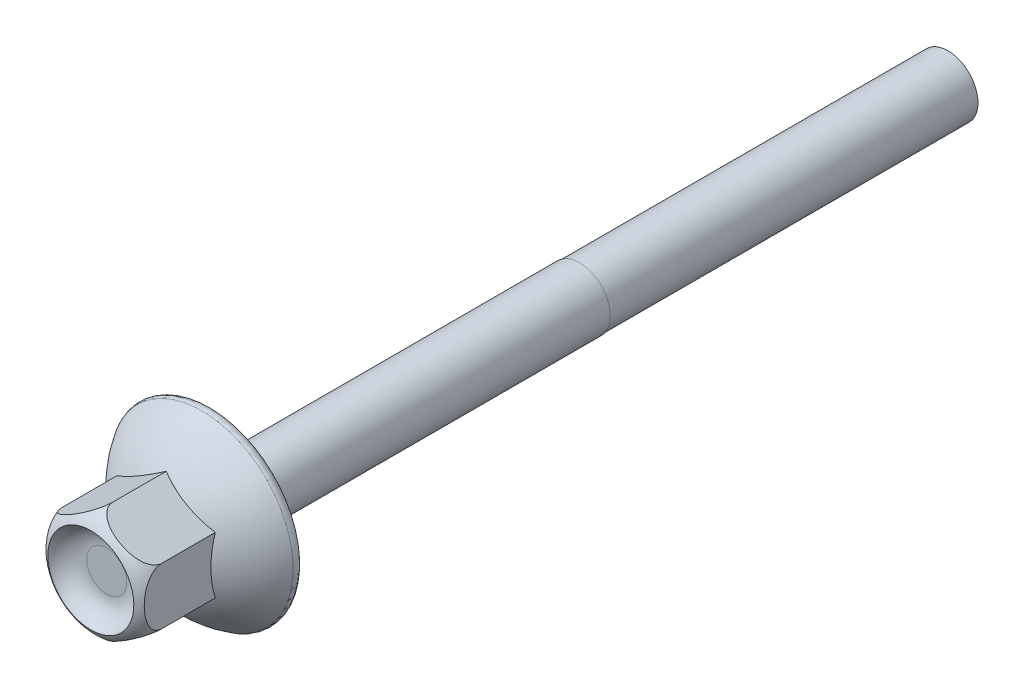
ISO-10303-21;
HEADER;
FILE_DESCRIPTION(('STEP AP214'),'2;1');
FILE_NAME('part.step','',(''),(''),'','','');
FILE_SCHEMA(('AUTOMOTIVE_DESIGN { 1 0 10303 214 1 1 1 1 }'));
ENDSEC;
DATA;
#1=APPLICATION_CONTEXT('core data for automotive mechanical design processes');
#2=APPLICATION_PROTOCOL_DEFINITION('international standard','automotive_design',2000,#1);
#3=PRODUCT_CONTEXT('',#1,'mechanical');
#4=PRODUCT('Part','Part','',(#3));
#5=PRODUCT_RELATED_PRODUCT_CATEGORY('part','',(#4));
#6=PRODUCT_DEFINITION_FORMATION('','',#4);
#7=PRODUCT_DEFINITION_CONTEXT('part definition',#1,'design');
#8=PRODUCT_DEFINITION('design','',#6,#7);
#9=PRODUCT_DEFINITION_SHAPE('','',#8);
#10=(LENGTH_UNIT() NAMED_UNIT(*) SI_UNIT(.MILLI.,.METRE.));
#11=(NAMED_UNIT(*) PLANE_ANGLE_UNIT() SI_UNIT($,.RADIAN.));
#12=(NAMED_UNIT(*) SI_UNIT($,.STERADIAN.) SOLID_ANGLE_UNIT());
#13=UNCERTAINTY_MEASURE_WITH_UNIT(LENGTH_MEASURE(1.E-05),#10,'distance_accuracy_value','');
#14=(GEOMETRIC_REPRESENTATION_CONTEXT(3) GLOBAL_UNCERTAINTY_ASSIGNED_CONTEXT((#13)) GLOBAL_UNIT_ASSIGNED_CONTEXT((#10,
#11,#12)) REPRESENTATION_CONTEXT('',''));
#15=CARTESIAN_POINT('',(0.,0.,0.));
#16=DIRECTION('',(0.,0.,1.));
#17=DIRECTION('',(1.,0.,0.));
#18=AXIS2_PLACEMENT_3D('',#15,#16,#17);
#19=CARTESIAN_POINT('',(0.,0.,-60.));
#20=DIRECTION('',(0.,0.,1.));
#21=DIRECTION('',(1.,0.,0.));
#22=AXIS2_PLACEMENT_3D('',#19,#20,#21);
#23=CYLINDRICAL_SURFACE('',#22,2.5);
#24=CARTESIAN_POINT('',(0.,0.,-0.5));
#25=DIRECTION('',(0.,0.,-1.));
#26=DIRECTION('',(-1.,0.,0.));
#27=AXIS2_PLACEMENT_3D('',#24,#25,#26);
#28=CIRCLE('',#27,2.5);
#29=CARTESIAN_POINT('',(-2.5,0.,-0.5));
#30=VERTEX_POINT('',#29);
#31=EDGE_CURVE('E43',#30,#30,#28,.T.);
#32=ORIENTED_EDGE('',*,*,#31,.T.);
#33=EDGE_LOOP('',(#32));
#34=FACE_BOUND('',#33,.T.);
#35=CARTESIAN_POINT('',(0.,0.,-30.));
#36=DIRECTION('',(0.,0.,1.));
#37=DIRECTION('',(1.,0.,0.));
#38=AXIS2_PLACEMENT_3D('',#35,#36,#37);
#39=CIRCLE('',#38,2.5);
#40=CARTESIAN_POINT('',(2.5,0.,-30.));
#41=VERTEX_POINT('',#40);
#42=EDGE_CURVE('E242',#41,#41,#39,.T.);
#43=ORIENTED_EDGE('',*,*,#42,.T.);
#44=EDGE_LOOP('',(#43));
#45=FACE_BOUND('',#44,.T.);
#46=ADVANCED_FACE('F35',(#34,#45),#23,.T.);
#47=CARTESIAN_POINT('',(0.,4.618802153517,10.));
#48=DIRECTION('',(0.500000000000002,0.866025403784438,0.));
#49=DIRECTION('',(-0.866025403784438,0.500000000000002,0.));
#50=AXIS2_PLACEMENT_3D('',#47,#48,#49);
#51=PLANE('',#50);
#52=DIRECTION('',(0.,0.,-1.));
#53=VECTOR('',#52,1.);
#54=CARTESIAN_POINT('',(0.,4.618802153517,10.));
#55=LINE('',#54,#53);
#56=CARTESIAN_POINT('',(0.,4.618802153517,8.));
#57=VERTEX_POINT('',#56);
#58=CARTESIAN_POINT('',(0.,4.618802153517,3.65904363431918));
#59=VERTEX_POINT('',#58);
#60=EDGE_CURVE('E57',#57,#59,#55,.T.);
#61=ORIENTED_EDGE('',*,*,#60,.F.);
#62=CARTESIAN_POINT('',(1.73205083404458E-08,4.618802143517,7.9998));
#63=CARTESIAN_POINT('',(-1.22893199091104E-05,4.61880924875916,8.03431816225581));
#64=CARTESIAN_POINT('',(0.00153740433550257,4.61791453271004,8.06881155614293));
#65=CARTESIAN_POINT('',(0.00768344122339801,4.61436611665837,8.13740227827127));
#66=CARTESIAN_POINT('',(0.0122768861959812,4.61171408996694,8.17149995192029));
#67=CARTESIAN_POINT('',(0.0303716647498532,4.60126706469794,8.27200231166166));
#68=CARTESIAN_POINT('',(0.0481914301600321,4.59097881834147,8.33742428596317));
#69=CARTESIAN_POINT('',(0.093856980602336,4.56461380050092,8.46303313534248));
#70=CARTESIAN_POINT('',(0.121669862935469,4.54855602539894,8.52323639507381));
#71=CARTESIAN_POINT('',(0.185534124885321,4.5116839765706,8.63763523809825));
#72=CARTESIAN_POINT('',(0.221607223554268,4.49085716334358,8.69181441386976));
#73=CARTESIAN_POINT('',(0.313278704321013,4.43793060924589,8.81056740803764));
#74=CARTESIAN_POINT('',(0.371372616509075,4.40439007340583,8.87255920534204));
#75=CARTESIAN_POINT('',(0.49530398483919,4.3328382645394,8.98503906118911));
#76=CARTESIAN_POINT('',(0.561152304063222,4.29482071970972,9.03551068347922));
#77=CARTESIAN_POINT('',(0.733755651620931,4.19516813053424,9.14968315939336));
#78=CARTESIAN_POINT('',(0.843898079630224,4.13157737007388,9.20650397866911));
#79=CARTESIAN_POINT('',(1.07039157410927,4.0008112900667,9.30028658003631));
#80=CARTESIAN_POINT('',(1.18676057515877,3.93362561598545,9.33718718015741));
#81=CARTESIAN_POINT('',(1.39790502062674,3.81172131355662,9.38850358731781));
#82=CARTESIAN_POINT('',(1.49214319825864,3.7573128763329,9.4059982010007));
#83=CARTESIAN_POINT('',(1.68161527504161,3.64792112179834,9.43174086051479));
#84=CARTESIAN_POINT('',(1.77684983094431,3.59293742531176,9.43998236155293));
#85=CARTESIAN_POINT('',(1.96762379577052,3.48279402536497,9.44776580637858));
#86=CARTESIAN_POINT('',(2.06316332721299,3.42763425116841,9.44730364841325));
#87=CARTESIAN_POINT('',(2.25385330445278,3.31753934147725,9.43763209638059));
#88=CARTESIAN_POINT('',(2.34900394314503,3.26260409461472,9.42842775591044));
#89=CARTESIAN_POINT('',(2.57149003936678,3.13415168707014,9.39582481243822));
#90=CARTESIAN_POINT('',(2.6984282107637,3.06086389964369,9.36858439465794));
#91=CARTESIAN_POINT('',(2.94767138798115,2.91696328418352,9.2939671828279));
#92=CARTESIAN_POINT('',(3.0699890748671,2.84634313473326,9.24665064490689));
#93=CARTESIAN_POINT('',(3.26512073125793,2.7336838203886,9.14753213422416));
#94=CARTESIAN_POINT('',(3.34059182625356,2.69011056337683,9.10276216334356));
#95=CARTESIAN_POINT('',(3.48508090858181,2.60668975279966,9.00084422971363));
#96=CARTESIAN_POINT('',(3.55410599437833,2.5668381009342,8.94371011827995));
#97=CARTESIAN_POINT('',(3.66659330634959,2.50189352108717,8.83149504832667));
#98=CARTESIAN_POINT('',(3.71219218806112,2.47556699445628,8.77928649137942));
#99=CARTESIAN_POINT('',(3.79559765567049,2.42741282528012,8.66709210430393));
#100=CARTESIAN_POINT('',(3.83341346507607,2.40557985754019,8.60711561874414));
#101=CARTESIAN_POINT('',(3.89317358441181,2.37107733655489,8.49125810526627));
#102=CARTESIAN_POINT('',(3.91673672931674,2.35747314850108,8.43649352353463));
#103=CARTESIAN_POINT('',(3.95561680150908,2.33502572835472,8.3232176935301));
#104=CARTESIAN_POINT('',(3.97094866071704,2.32617387531383,8.26471344648954));
#105=CARTESIAN_POINT('',(3.98773636101545,2.31648149202746,8.17140101328874));
#106=CARTESIAN_POINT('',(3.99232622342284,2.31383153373101,8.13731321282773));
#107=CARTESIAN_POINT('',(3.9984657336852,2.31028688582834,8.06875760714334));
#108=CARTESIAN_POINT('',(4.00001380349469,2.30939310730711,8.03428961399965));
#109=CARTESIAN_POINT('',(3.99999998267949,2.30940108675849,7.9998));
#110=B_SPLINE_CURVE_WITH_KNOTS('',3,(#62,#63,#64,#65,#66,#67,#68,#69,#70,#71,#72,#73,#74,#75,
#76,#77,#78,#79,#80,#81,#82,#83,#84,#85,#86,#87,#88,#89,#90,#91,#92,#93,#94,#95,#96,#97,#98,#99,
#100,#101,#102,#103,#104,#105,#106,#107,#108,#109),.UNSPECIFIED.,.F.,.F.,(4,2,2,2,2,2,2,2,2,2,2,
2,2,2,2,2,2,2,2,2,2,2,2,4),(0.,0.103460373374438,0.206822373079677,0.411167373809311,
0.614845635749005,0.819065718174849,1.09157298206689,1.36446664498791,1.7800386431327,
2.1968798497368,2.52710929235976,2.8575721617821,3.18819077155664,3.51861837673778,
3.96475340106484,4.40955877111132,4.70268001276403,4.9954745605869,5.21714730311258,
5.43855581516425,5.6212654228744,5.80364245756453,5.90696999189714,6.01035111717634),.UNSPECIFIED.);
#111=CARTESIAN_POINT('',(4.00000000000001,2.30940107675848,8.));
#112=VERTEX_POINT('',#111);
#113=EDGE_CURVE('E50',#57,#112,#110,.T.);
#114=ORIENTED_EDGE('',*,*,#113,.T.);
#115=DIRECTION('',(0.,0.,-1.));
#116=VECTOR('',#115,1.);
#117=CARTESIAN_POINT('',(4.00000000000001,2.30940107675848,10.));
#118=LINE('',#117,#116);
#119=CARTESIAN_POINT('',(4.00000000000001,2.30940107675848,3.65904363431918));
#120=VERTEX_POINT('',#119);
#121=EDGE_CURVE('E98',#112,#120,#118,.T.);
#122=ORIENTED_EDGE('',*,*,#121,.T.);
#123=CARTESIAN_POINT('',(2.,3.46410161513774,-3.62499999999999));
#124=DIRECTION('',(0.500000000000002,0.866025403784438,0.));
#125=DIRECTION('',(-0.866025403784438,0.500000000000002,0.));
#126=AXIS2_PLACEMENT_3D('',#123,#124,#125);
#127=CIRCLE('',#126,7.6413758577889);
#128=EDGE_CURVE('E114',#120,#59,#127,.F.);
#129=ORIENTED_EDGE('',*,*,#128,.T.);
#130=EDGE_LOOP('',(#61,#114,#122,#129));
#131=FACE_BOUND('',#130,.T.);
#132=ADVANCED_FACE('F96',(#131),#51,.T.);
#133=CARTESIAN_POINT('',(4.00000000000001,2.30940107675848,10.));
#134=DIRECTION('',(1.,0.,0.));
#135=DIRECTION('',(0.,1.,0.));
#136=AXIS2_PLACEMENT_3D('',#133,#134,#135);
#137=PLANE('',#136);
#138=ORIENTED_EDGE('',*,*,#121,.F.);
#139=CARTESIAN_POINT('',(4.0000008798372,0.,9.44647626933986));
#140=CARTESIAN_POINT('',(4.00000085360112,-0.105466150957724,9.44647501003865));
#141=CARTESIAN_POINT('',(4.00000022876832,-0.210927246680293,9.44251378588974));
#142=CARTESIAN_POINT('',(3.99999977108024,-0.42131102905597,9.42641245729071));
#143=CARTESIAN_POINT('',(3.99999993874952,-0.526233313069076,9.414266940212));
#144=CARTESIAN_POINT('',(4.00000006109713,-0.734423127406882,9.3810900843605));
#145=CARTESIAN_POINT('',(4.00000001630765,-0.837694142877952,9.36008106793654));
#146=CARTESIAN_POINT('',(3.99999998371291,-1.04159399744332,9.30799308096921));
#147=CARTESIAN_POINT('',(3.99999999583586,-1.14222600388928,9.27692684111259));
#148=CARTESIAN_POINT('',(4.00000000377332,-1.32993087173156,9.20655533408771));
#149=CARTESIAN_POINT('',(4.00000000101161,-1.41738990231294,9.16829694595899));
#150=CARTESIAN_POINT('',(3.99999999898802,-1.58675370869468,9.0807236694283));
#151=CARTESIAN_POINT('',(3.9999999997274,-1.66865647242821,9.03140480328761));
#152=CARTESIAN_POINT('',(4.00000000027644,-1.82487594062848,8.91960170963039));
#153=CARTESIAN_POINT('',(4.00000000007283,-1.89906939872269,8.85694165578261));
#154=CARTESIAN_POINT('',(3.99999999992741,-2.03368206130457,8.71823168944842));
#155=CARTESIAN_POINT('',(3.99999999998469,-2.09414776283572,8.64222857080319));
#156=CARTESIAN_POINT('',(4.00000000000966,-2.17679914371866,8.50839655438855));
#157=CARTESIAN_POINT('',(4.00000000000258,-2.20488020236459,8.45419130281619));
#158=CARTESIAN_POINT('',(3.99999999999741,-2.25173689028514,8.34187413839059));
#159=CARTESIAN_POINT('',(3.9999999999993,-2.27051896731099,8.283764964289));
#160=CARTESIAN_POINT('',(4.00000000000069,-2.29760634851835,8.16482656570708));
#161=CARTESIAN_POINT('',(4.00000000000018,-2.30586019211316,8.10398547411485));
#162=CARTESIAN_POINT('',(3.99999999999981,-2.31110095157678,7.98181716174626));
#163=CARTESIAN_POINT('',(3.99999999999995,-2.30808963630325,7.92049001879874));
#164=CARTESIAN_POINT('',(4.00000000000004,-2.29167428794451,7.80389416202003));
#165=CARTESIAN_POINT('',(4.00000000000001,-2.27905330892728,7.74851225977821));
#166=CARTESIAN_POINT('',(3.99999999999998,-2.24513940042888,7.64049457018806));
#167=CARTESIAN_POINT('',(3.99999999999999,-2.22384549345326,7.58785909313403));
#168=CARTESIAN_POINT('',(4.,-2.17240359196328,7.48369756089591));
#169=CARTESIAN_POINT('',(4.,-2.14185153188739,7.43237274586351));
#170=CARTESIAN_POINT('',(3.99999999999999,-2.07385755974207,7.33454257718955));
#171=CARTESIAN_POINT('',(4.,-2.03641172978866,7.28803998773962));
#172=CARTESIAN_POINT('',(4.,-1.93387526489485,7.17589475761132));
#173=CARTESIAN_POINT('',(4.,-1.86490653793588,7.11379020091006));
#174=CARTESIAN_POINT('',(4.,-1.71798618081103,7.00135109459505));
#175=CARTESIAN_POINT('',(4.,-1.64001428213157,6.95104390652562));
#176=CARTESIAN_POINT('',(4.,-1.43551056630488,6.8373640207581));
#177=CARTESIAN_POINT('',(4.,-1.30505803550507,6.78109574593696));
#178=CARTESIAN_POINT('',(4.,-1.03711805910515,6.68886488522981));
#179=CARTESIAN_POINT('',(4.,-0.899610350073927,6.65296482290159));
#180=CARTESIAN_POINT('',(4.,-0.651254837129302,6.60394878199864));
#181=CARTESIAN_POINT('',(4.,-0.541017124907805,6.58759695984231));
#182=CARTESIAN_POINT('',(4.,-0.319491890305449,6.56422994713976));
#183=CARTESIAN_POINT('',(4.,-0.208203680944488,6.55722136436808));
#184=CARTESIAN_POINT('',(4.,0.0145780221954298,6.55206577272236));
#185=CARTESIAN_POINT('',(4.,0.126071526164903,6.55391921628541));
#186=CARTESIAN_POINT('',(4.,0.348477846232864,6.56662247812742));
#187=CARTESIAN_POINT('',(4.,0.459390984703597,6.57746661178463));
#188=CARTESIAN_POINT('',(4.,0.711465235515293,6.61336333324992));
#189=CARTESIAN_POINT('',(4.,0.852196697243031,6.64159453641364));
#190=CARTESIAN_POINT('',(4.,1.1283581749922,6.71709699547166));
#191=CARTESIAN_POINT('',(4.,1.26380137044526,6.76431709575379));
#192=CARTESIAN_POINT('',(4.,1.48275441367143,6.86334779079508));
#193=CARTESIAN_POINT('',(4.,1.56906661689595,6.90890745849698));
#194=CARTESIAN_POINT('',(4.00000000000001,1.73401701055087,7.01242012306373));
#195=CARTESIAN_POINT('',(4.00000000000001,1.81266446733514,7.07035787775811));
#196=CARTESIAN_POINT('',(4.00000000000001,1.93995118955534,7.18349351406201));
#197=CARTESIAN_POINT('',(4.,1.99117957775681,7.23576242092048));
#198=CARTESIAN_POINT('',(4.00000000000001,2.08463823179358,7.34783808314025));
#199=CARTESIAN_POINT('',(4.00000000000001,2.12688019905946,7.40763487265992));
#200=CARTESIAN_POINT('',(4.,2.19359280140607,7.52329533478277));
#201=CARTESIAN_POINT('',(3.99999999999999,2.2198598215729,7.57811815968587));
#202=CARTESIAN_POINT('',(4.00000000000002,2.2628951132223,7.69139651436518));
#203=CARTESIAN_POINT('',(4.00000000000005,2.27966815513076,7.74985020333121));
#204=CARTESIAN_POINT('',(3.99999999999996,2.30264042350763,7.86908547674024));
#205=CARTESIAN_POINT('',(3.99999999999983,2.30879421370326,7.92987593214806));
#206=CARTESIAN_POINT('',(4.00000000000018,2.30992177386939,8.05155904874441));
#207=CARTESIAN_POINT('',(4.00000000000065,2.30489688405359,8.11245169680644));
#208=CARTESIAN_POINT('',(3.99999999999941,2.28479874260211,8.22807332358309));
#209=CARTESIAN_POINT('',(3.99999999999786,2.27046236026841,8.28293339832971));
#210=CARTESIAN_POINT('',(4.00000000000216,2.23334185840391,8.38969270646379));
#211=CARTESIAN_POINT('',(4.00000000000801,2.21055643837324,8.44159148261999));
#212=CARTESIAN_POINT('',(3.99999999999147,2.15594108445543,8.54482345264107));
#213=CARTESIAN_POINT('',(3.99999999996716,2.12361066383931,8.59588978736414));
#214=CARTESIAN_POINT('',(4.00000000003287,2.05218238372082,8.69300410629949));
#215=CARTESIAN_POINT('',(4.00000000012293,2.01308131606021,8.73904969458199));
#216=CARTESIAN_POINT('',(3.99999999980631,1.90542303730398,8.85098550466477));
#217=CARTESIAN_POINT('',(3.99999999908378,1.83286745566034,8.91303884749733));
#218=CARTESIAN_POINT('',(4.00000000091891,1.67881268306548,9.02488279314659));
#219=CARTESIAN_POINT('',(4.00000000348615,1.59728799272005,9.07463705568031));
#220=CARTESIAN_POINT('',(3.99999999461943,1.38263953751948,9.18715574919528));
#221=CARTESIAN_POINT('',(3.99999997481886,1.24555032508088,9.24229763663448));
#222=CARTESIAN_POINT('',(4.00000002520211,0.96491097271679,9.33125188439419));
#223=CARTESIAN_POINT('',(4.00000009546082,0.821355551429047,9.36504645774144));
#224=CARTESIAN_POINT('',(3.99999992654487,0.564786993963609,9.40927801617972));
#225=CARTESIAN_POINT('',(3.99999975496743,0.45236172927253,9.42330357114715));
#226=CARTESIAN_POINT('',(4.00000024528229,0.226622890414398,9.44190819509308));
#227=CARTESIAN_POINT('',(4.00000090802417,0.113308527710544,9.44647762228167));
#228=CARTESIAN_POINT('',(4.0000008798372,0.,9.44647626933986));
#229=B_SPLINE_CURVE_WITH_KNOTS('',3,(#139,#140,#141,#142,#143,#144,#145,#146,#147,#148,#149,
#150,#151,#152,#153,#154,#155,#156,#157,#158,#159,#160,#161,#162,#163,#164,#165,#166,#167,#168,
#169,#170,#171,#172,#173,#174,#175,#176,#177,#178,#179,#180,#181,#182,#183,#184,#185,#186,#187,
#188,#189,#190,#191,#192,#193,#194,#195,#196,#197,#198,#199,#200,#201,#202,#203,#204,#205,#206,
#207,#208,#209,#210,#211,#212,#213,#214,#215,#216,#217,#218,#219,#220,#221,#222,#223,#224,#225,
#226,#227,#228),.UNSPECIFIED.,.T.,.F.,(4,2,2,2,2,2,2,2,2,2,2,2,2,2,2,2,2,2,2,2,2,2,2,2,2,2,2,2,
2,2,2,2,2,2,2,2,2,2,2,2,2,2,2,2,4),(0.,0.316312434418643,0.632834265572159,0.948563664083408,
1.26389495690038,1.54963195069762,1.83547187087507,2.1253421295481,2.41421541839483,
2.59663728112161,2.77893247795173,2.9621153369615,3.14526943376684,3.31491232622655,
3.48457434381841,3.66309028000507,3.84170798576278,4.11855470952518,4.39603730798994,
4.81987942099341,5.24501564350217,5.57893546715158,5.91309132226045,6.24726423736329,
6.58122602304461,7.010784516001,7.43919345966316,7.73116970853082,8.0227884738856,
8.24158227610568,8.46008941393193,8.64169989159443,8.82321903450388,9.00551292980246,
9.18778497103495,9.35714779278195,9.52653669416388,9.70718402608923,9.8879171901492,
10.1727012839739,10.4583170373663,10.8991409352233,11.3403316528124,11.6798188387439,
12.0196520071591),.UNSPECIFIED.);
#230=CARTESIAN_POINT('',(4.,-2.3094010767585,8.));
#231=VERTEX_POINT('',#230);
#232=EDGE_CURVE('E87',#112,#231,#229,.T.);
#233=ORIENTED_EDGE('',*,*,#232,.T.);
#234=DIRECTION('',(0.,0.,-1.));
#235=VECTOR('',#234,1.);
#236=CARTESIAN_POINT('',(3.99999999999999,-2.3094010767585,10.));
#237=LINE('',#236,#235);
#238=CARTESIAN_POINT('',(4.,-2.3094010767585,3.65904363431918));
#239=VERTEX_POINT('',#238);
#240=EDGE_CURVE('E106',#231,#239,#237,.T.);
#241=ORIENTED_EDGE('',*,*,#240,.T.);
#242=CARTESIAN_POINT('',(4.,0.,-3.62499999999999));
#243=DIRECTION('',(1.,0.,0.));
#244=DIRECTION('',(0.,1.,0.));
#245=AXIS2_PLACEMENT_3D('',#242,#243,#244);
#246=CIRCLE('',#245,7.64137585778889);
#247=EDGE_CURVE('E105',#239,#120,#246,.F.);
#248=ORIENTED_EDGE('',*,*,#247,.T.);
#249=EDGE_LOOP('',(#138,#233,#241,#248));
#250=FACE_BOUND('',#249,.T.);
#251=ADVANCED_FACE('F103',(#250),#137,.T.);
#252=CARTESIAN_POINT('',(3.99999999999999,-2.3094010767585,10.));
#253=DIRECTION('',(0.5,-0.866025403784438,0.));
#254=DIRECTION('',(0.866025403784438,0.5,0.));
#255=AXIS2_PLACEMENT_3D('',#252,#253,#254);
#256=PLANE('',#255);
#257=ORIENTED_EDGE('',*,*,#240,.F.);
#258=CARTESIAN_POINT('',(3.99999998267949,-2.3094010867585,7.9998));
#259=CARTESIAN_POINT('',(4.0000122893199,-2.30939398151634,8.03431816225581));
#260=CARTESIAN_POINT('',(3.99846259566449,-2.31028869756545,8.06881155614293));
#261=CARTESIAN_POINT('',(3.9923165587766,-2.31383711361713,8.13740227827127));
#262=CARTESIAN_POINT('',(3.98772311380402,-2.31648914030856,8.17149995192029));
#263=CARTESIAN_POINT('',(3.96962833525014,-2.32693616557756,8.27200231166166));
#264=CARTESIAN_POINT('',(3.95180856983997,-2.33722441193402,8.33742428596317));
#265=CARTESIAN_POINT('',(3.90614301939766,-2.36358942977458,8.46303313534248));
#266=CARTESIAN_POINT('',(3.87833013706453,-2.37964720487655,8.52323639507381));
#267=CARTESIAN_POINT('',(3.81446587511468,-2.4165192537049,8.63763523809824));
#268=CARTESIAN_POINT('',(3.77839277644573,-2.43734606693192,8.69181441386976));
#269=CARTESIAN_POINT('',(3.68672129567898,-2.49027262102961,8.81056740803764));
#270=CARTESIAN_POINT('',(3.62862738349092,-2.52381315686967,8.87255920534204));
#271=CARTESIAN_POINT('',(3.50469601516081,-2.5953649657361,8.98503906118911));
#272=CARTESIAN_POINT('',(3.43884769593677,-2.63338251056578,9.03551068347922));
#273=CARTESIAN_POINT('',(3.26624434837906,-2.73303509974125,9.14968315939336));
#274=CARTESIAN_POINT('',(3.15610192036977,-2.79662586020162,9.2065039786691));
#275=CARTESIAN_POINT('',(2.92960842589073,-2.92739194020879,9.30028658003631));
#276=CARTESIAN_POINT('',(2.81323942484123,-2.99457761429005,9.3371871801574));
#277=CARTESIAN_POINT('',(2.60209497937325,-3.11648191671888,9.38850358731781));
#278=CARTESIAN_POINT('',(2.50785680174135,-3.17089035394259,9.4059982010007));
#279=CARTESIAN_POINT('',(2.31838472495839,-3.28028210847716,9.43174086051479));
#280=CARTESIAN_POINT('',(2.22315016905569,-3.33526580496374,9.43998236155293));
#281=CARTESIAN_POINT('',(2.03237620422947,-3.44540920491052,9.44776580637858));
#282=CARTESIAN_POINT('',(1.93683667278701,-3.50056897910708,9.44730364841324));
#283=CARTESIAN_POINT('',(1.74614669554722,-3.61066388879824,9.43763209638058));
#284=CARTESIAN_POINT('',(1.65099605685497,-3.66559913566077,9.42842775591044));
#285=CARTESIAN_POINT('',(1.42850996063322,-3.79405154320535,9.39582481243822));
#286=CARTESIAN_POINT('',(1.3015717892363,-3.8673393306318,9.36858439465794));
#287=CARTESIAN_POINT('',(1.05232861201885,-4.01123994609197,9.2939671828279));
#288=CARTESIAN_POINT('',(0.930010925132904,-4.08186009554222,9.24665064490689));
#289=CARTESIAN_POINT('',(0.734879268742072,-4.19451940988689,9.14753213422416));
#290=CARTESIAN_POINT('',(0.659408173746437,-4.23809266689866,9.10276216334355));
#291=CARTESIAN_POINT('',(0.514919091418188,-4.32151347747583,9.00084422971363));
#292=CARTESIAN_POINT('',(0.445894005621676,-4.36136512934128,8.94371011827995));
#293=CARTESIAN_POINT('',(0.333406693650409,-4.42630970918831,8.83149504832667));
#294=CARTESIAN_POINT('',(0.287807811938879,-4.45263623581921,8.77928649137941));
#295=CARTESIAN_POINT('',(0.204402344329511,-4.50079040499537,8.66709210430393));
#296=CARTESIAN_POINT('',(0.166586534923938,-4.5226233727353,8.60711561874414));
#297=CARTESIAN_POINT('',(0.106826415588197,-4.55712589372059,8.49125810526627));
#298=CARTESIAN_POINT('',(0.0832632706832636,-4.57073008177441,8.43649352353463));
#299=CARTESIAN_POINT('',(0.0443831984909263,-4.59317750192077,8.3232176935301));
#300=CARTESIAN_POINT('',(0.0290513392829685,-4.60202935496166,8.26471344648954));
#301=CARTESIAN_POINT('',(0.0122636389845534,-4.61172173824802,8.17140101328874));
#302=CARTESIAN_POINT('',(0.00767377657716848,-4.61437169654447,8.13731321282773));
#303=CARTESIAN_POINT('',(0.00153426631479705,-4.61791634444714,8.06875760714335));
#304=CARTESIAN_POINT('',(-1.38034946853573E-05,-4.61881012296837,8.03428961399965));
#305=CARTESIAN_POINT('',(1.73205087409552E-08,-4.618802143517,7.9998));
#306=B_SPLINE_CURVE_WITH_KNOTS('',3,(#258,#259,#260,#261,#262,#263,#264,#265,#266,#267,#268,
#269,#270,#271,#272,#273,#274,#275,#276,#277,#278,#279,#280,#281,#282,#283,#284,#285,#286,#287,
#288,#289,#290,#291,#292,#293,#294,#295,#296,#297,#298,#299,#300,#301,#302,#303,#304,#305),
.UNSPECIFIED.,.F.,.F.,(4,2,2,2,2,2,2,2,2,2,2,2,2,2,2,2,2,2,2,2,2,2,2,4),(0.,0.103460373374438,
0.206822373079676,0.411167373809311,0.614845635749005,0.819065718174848,1.09157298206689,
1.36446664498791,1.7800386431327,2.1968798497368,2.52710929235976,2.8575721617821,
3.18819077155664,3.51861837673777,3.96475340106483,4.40955877111131,4.70268001276402,
4.99547456058689,5.21714730311257,5.43855581516424,5.62126542287439,5.80364245756452,
5.90696999189712,6.01035111717632),.UNSPECIFIED.);
#307=CARTESIAN_POINT('',(0.,-4.618802153517,8.));
#308=VERTEX_POINT('',#307);
#309=EDGE_CURVE('E90',#231,#308,#306,.T.);
#310=ORIENTED_EDGE('',*,*,#309,.T.);
#311=DIRECTION('',(0.,0.,-1.));
#312=VECTOR('',#311,1.);
#313=CARTESIAN_POINT('',(0.,-4.618802153517,10.));
#314=LINE('',#313,#312);
#315=CARTESIAN_POINT('',(0.,-4.618802153517,3.65904363431918));
#316=VERTEX_POINT('',#315);
#317=EDGE_CURVE('E108',#308,#316,#314,.T.);
#318=ORIENTED_EDGE('',*,*,#317,.T.);
#319=CARTESIAN_POINT('',(2.,-3.46410161513775,-3.62499999999999));
#320=DIRECTION('',(0.5,-0.866025403784438,0.));
#321=DIRECTION('',(0.866025403784438,0.5,0.));
#322=AXIS2_PLACEMENT_3D('',#319,#320,#321);
#323=CIRCLE('',#322,7.6413758577889);
#324=EDGE_CURVE('E219',#316,#239,#323,.F.);
#325=ORIENTED_EDGE('',*,*,#324,.T.);
#326=EDGE_LOOP('',(#257,#310,#318,#325));
#327=FACE_BOUND('',#326,.T.);
#328=ADVANCED_FACE('F170',(#327),#256,.T.);
#329=CARTESIAN_POINT('',(0.,-4.618802153517,10.));
#330=DIRECTION('',(-0.500000000000002,-0.866025403784438,0.));
#331=DIRECTION('',(0.866025403784438,-0.500000000000002,0.));
#332=AXIS2_PLACEMENT_3D('',#329,#330,#331);
#333=PLANE('',#332);
#334=ORIENTED_EDGE('',*,*,#317,.F.);
#335=CARTESIAN_POINT('',(-1.73205083404458E-08,-4.618802143517,7.9998));
#336=CARTESIAN_POINT('',(1.22893199091104E-05,-4.61880924875916,8.03431816225581));
#337=CARTESIAN_POINT('',(-0.00153740433550257,-4.61791453271004,8.06881155614293));
#338=CARTESIAN_POINT('',(-0.00768344122339801,-4.61436611665837,8.13740227827127));
#339=CARTESIAN_POINT('',(-0.0122768861959812,-4.61171408996694,8.17149995192029));
#340=CARTESIAN_POINT('',(-0.0303716647498532,-4.60126706469794,8.27200231166166));
#341=CARTESIAN_POINT('',(-0.0481914301600321,-4.59097881834147,8.33742428596317));
#342=CARTESIAN_POINT('',(-0.093856980602336,-4.56461380050092,8.46303313534248));
#343=CARTESIAN_POINT('',(-0.121669862935469,-4.54855602539894,8.52323639507381));
#344=CARTESIAN_POINT('',(-0.185534124885321,-4.5116839765706,8.63763523809825));
#345=CARTESIAN_POINT('',(-0.221607223554268,-4.49085716334358,8.69181441386976));
#346=CARTESIAN_POINT('',(-0.313278704321013,-4.43793060924589,8.81056740803764));
#347=CARTESIAN_POINT('',(-0.371372616509075,-4.40439007340583,8.87255920534204));
#348=CARTESIAN_POINT('',(-0.49530398483919,-4.3328382645394,8.98503906118911));
#349=CARTESIAN_POINT('',(-0.561152304063222,-4.29482071970972,9.03551068347922));
#350=CARTESIAN_POINT('',(-0.733755651620931,-4.19516813053424,9.14968315939336));
#351=CARTESIAN_POINT('',(-0.843898079630224,-4.13157737007388,9.20650397866911));
#352=CARTESIAN_POINT('',(-1.07039157410927,-4.0008112900667,9.30028658003631));
#353=CARTESIAN_POINT('',(-1.18676057515877,-3.93362561598545,9.33718718015741));
#354=CARTESIAN_POINT('',(-1.39790502062674,-3.81172131355662,9.38850358731781));
#355=CARTESIAN_POINT('',(-1.49214319825864,-3.7573128763329,9.4059982010007));
#356=CARTESIAN_POINT('',(-1.68161527504161,-3.64792112179834,9.43174086051479));
#357=CARTESIAN_POINT('',(-1.77684983094431,-3.59293742531176,9.43998236155293));
#358=CARTESIAN_POINT('',(-1.96762379577052,-3.48279402536497,9.44776580637858));
#359=CARTESIAN_POINT('',(-2.06316332721299,-3.42763425116841,9.44730364841325));
#360=CARTESIAN_POINT('',(-2.25385330445278,-3.31753934147725,9.43763209638059));
#361=CARTESIAN_POINT('',(-2.34900394314503,-3.26260409461472,9.42842775591044));
#362=CARTESIAN_POINT('',(-2.57149003936678,-3.13415168707014,9.39582481243822));
#363=CARTESIAN_POINT('',(-2.6984282107637,-3.06086389964369,9.36858439465794));
#364=CARTESIAN_POINT('',(-2.94767138798115,-2.91696328418352,9.2939671828279));
#365=CARTESIAN_POINT('',(-3.0699890748671,-2.84634313473326,9.24665064490689));
#366=CARTESIAN_POINT('',(-3.26512073125793,-2.7336838203886,9.14753213422416));
#367=CARTESIAN_POINT('',(-3.34059182625356,-2.69011056337683,9.10276216334356));
#368=CARTESIAN_POINT('',(-3.48508090858181,-2.60668975279966,9.00084422971363));
#369=CARTESIAN_POINT('',(-3.55410599437833,-2.5668381009342,8.94371011827995));
#370=CARTESIAN_POINT('',(-3.66659330634959,-2.50189352108717,8.83149504832667));
#371=CARTESIAN_POINT('',(-3.71219218806112,-2.47556699445628,8.77928649137942));
#372=CARTESIAN_POINT('',(-3.79559765567049,-2.42741282528012,8.66709210430393));
#373=CARTESIAN_POINT('',(-3.83341346507607,-2.40557985754019,8.60711561874414));
#374=CARTESIAN_POINT('',(-3.89317358441181,-2.37107733655489,8.49125810526627));
#375=CARTESIAN_POINT('',(-3.91673672931674,-2.35747314850108,8.43649352353463));
#376=CARTESIAN_POINT('',(-3.95561680150908,-2.33502572835472,8.3232176935301));
#377=CARTESIAN_POINT('',(-3.97094866071704,-2.32617387531383,8.26471344648954));
#378=CARTESIAN_POINT('',(-3.98773636101545,-2.31648149202746,8.17140101328874));
#379=CARTESIAN_POINT('',(-3.99232622342284,-2.31383153373101,8.13731321282773));
#380=CARTESIAN_POINT('',(-3.9984657336852,-2.31028688582834,8.06875760714334));
#381=CARTESIAN_POINT('',(-4.00001380349469,-2.30939310730711,8.03428961399965));
#382=CARTESIAN_POINT('',(-3.99999998267949,-2.30940108675849,7.9998));
#383=B_SPLINE_CURVE_WITH_KNOTS('',3,(#335,#336,#337,#338,#339,#340,#341,#342,#343,#344,#345,
#346,#347,#348,#349,#350,#351,#352,#353,#354,#355,#356,#357,#358,#359,#360,#361,#362,#363,#364,
#365,#366,#367,#368,#369,#370,#371,#372,#373,#374,#375,#376,#377,#378,#379,#380,#381,#382),
.UNSPECIFIED.,.F.,.F.,(4,2,2,2,2,2,2,2,2,2,2,2,2,2,2,2,2,2,2,2,2,2,2,4),(0.,0.103460373374438,
0.206822373079677,0.411167373809311,0.614845635749005,0.819065718174849,1.09157298206689,
1.36446664498791,1.7800386431327,2.1968798497368,2.52710929235976,2.8575721617821,
3.18819077155664,3.51861837673778,3.96475340106484,4.40955877111132,4.70268001276403,
4.9954745605869,5.21714730311258,5.43855581516425,5.6212654228744,5.80364245756453,
5.90696999189714,6.01035111717634),.UNSPECIFIED.);
#384=CARTESIAN_POINT('',(-4.00000000000001,-2.30940107675848,8.));
#385=VERTEX_POINT('',#384);
#386=EDGE_CURVE('E151',#308,#385,#383,.T.);
#387=ORIENTED_EDGE('',*,*,#386,.T.);
#388=DIRECTION('',(0.,0.,-1.));
#389=VECTOR('',#388,1.);
#390=CARTESIAN_POINT('',(-4.00000000000001,-2.30940107675848,10.));
#391=LINE('',#390,#389);
#392=CARTESIAN_POINT('',(-4.00000000000001,-2.30940107675848,3.65904363431918));
#393=VERTEX_POINT('',#392);
#394=EDGE_CURVE('E210',#385,#393,#391,.T.);
#395=ORIENTED_EDGE('',*,*,#394,.T.);
#396=CARTESIAN_POINT('',(-2.,-3.46410161513774,-3.62499999999999));
#397=DIRECTION('',(-0.500000000000002,-0.866025403784438,0.));
#398=DIRECTION('',(0.866025403784438,-0.500000000000002,0.));
#399=AXIS2_PLACEMENT_3D('',#396,#397,#398);
#400=CIRCLE('',#399,7.6413758577889);
#401=EDGE_CURVE('E207',#393,#316,#400,.F.);
#402=ORIENTED_EDGE('',*,*,#401,.T.);
#403=EDGE_LOOP('',(#334,#387,#395,#402));
#404=FACE_BOUND('',#403,.T.);
#405=ADVANCED_FACE('F193',(#404),#333,.T.);
#406=CARTESIAN_POINT('',(-4.00000000000001,-2.30940107675848,10.));
#407=DIRECTION('',(-1.,0.,0.));
#408=DIRECTION('',(0.,-1.,0.));
#409=AXIS2_PLACEMENT_3D('',#406,#407,#408);
#410=PLANE('',#409);
#411=ORIENTED_EDGE('',*,*,#394,.F.);
#412=CARTESIAN_POINT('',(-4.,0.,9.44647589294521));
#413=CARTESIAN_POINT('',(-4.,0.105466168643425,9.44647464487393));
#414=CARTESIAN_POINT('',(-4.,0.210927282060129,9.4425136865416));
#415=CARTESIAN_POINT('',(-4.,0.421311080071461,9.42641255011478));
#416=CARTESIAN_POINT('',(-4.,0.526233362089377,9.41426696008755));
#417=CARTESIAN_POINT('',(-4.,0.734423162439709,9.38109005115956));
#418=CARTESIAN_POINT('',(-4.,0.837694166072555,9.36008105539773));
#419=CARTESIAN_POINT('',(-4.,1.0415940050787,9.30799308561976));
#420=CARTESIAN_POINT('',(-4.,1.14222600760398,9.27692684151555));
#421=CARTESIAN_POINT('',(-4.,1.32993086950092,9.20655533329689));
#422=CARTESIAN_POINT('',(-4.,1.41738989797307,9.16829694741877));
#423=CARTESIAN_POINT('',(-4.,1.58675370465427,9.08072367230077));
#424=CARTESIAN_POINT('',(-4.,1.6686564705194,9.03140480477383));
#425=CARTESIAN_POINT('',(-4.,1.82487594147508,8.91960170890268));
#426=CARTESIAN_POINT('',(-3.99999999999999,1.89906940031375,8.85694165440473));
#427=CARTESIAN_POINT('',(-3.99999999999999,2.03368206260078,8.71823168785386));
#428=CARTESIAN_POINT('',(-3.99999999999999,2.09414776337944,8.64222856993084));
#429=CARTESIAN_POINT('',(-3.99999999999999,2.17679914361911,8.50839655454465));
#430=CARTESIAN_POINT('',(-3.99999999999999,2.20488020218861,8.45419130315483));
#431=CARTESIAN_POINT('',(-3.99999999999999,2.25173689016751,8.3418741387555));
#432=CARTESIAN_POINT('',(-3.99999999999999,2.27051896726947,8.28376496447273));
#433=CARTESIAN_POINT('',(-3.99999999999999,2.29760634853188,8.16482656564625));
#434=CARTESIAN_POINT('',(-3.99999999999999,2.30586019212899,8.10398547399603));
#435=CARTESIAN_POINT('',(-3.99999999999999,2.31110095157117,7.98181716162698));
#436=CARTESIAN_POINT('',(-3.99999999999999,2.30808963629496,7.9204900187379));
#437=CARTESIAN_POINT('',(-3.99999999999999,2.29167428794563,7.80389416202975));
#438=CARTESIAN_POINT('',(-3.99999999999999,2.27905330893243,7.74851225980123));
#439=CARTESIAN_POINT('',(-3.99999999999999,2.24513940043782,7.6404945702099));
#440=CARTESIAN_POINT('',(-3.99999999999999,2.22384549345777,7.58785909314272));
#441=CARTESIAN_POINT('',(-3.99999999999999,2.17240359195968,7.48369756088908));
#442=CARTESIAN_POINT('',(-3.99999999999999,2.14185153188142,7.43237274585367));
#443=CARTESIAN_POINT('',(-3.99999999999999,2.07385755973484,7.3345425771804));
#444=CARTESIAN_POINT('',(-3.99999999999999,2.03641172978337,7.28803998773356));
#445=CARTESIAN_POINT('',(-3.99999999999999,1.93387526489241,7.17589475760907));
#446=CARTESIAN_POINT('',(-4.,1.86490653793418,7.11379020090868));
#447=CARTESIAN_POINT('',(-4.,1.71798618080874,7.00135109459337));
#448=CARTESIAN_POINT('',(-4.,1.64001428212769,6.95104390652315));
#449=CARTESIAN_POINT('',(-4.,1.43551056629819,6.83736402075487));
#450=CARTESIAN_POINT('',(-4.,1.3050580354972,6.78109574593373));
#451=CARTESIAN_POINT('',(-4.,1.03711805909573,6.68886488522708));
#452=CARTESIAN_POINT('',(-4.,0.899610350064148,6.65296482289923));
#453=CARTESIAN_POINT('',(-4.,0.651254837118895,6.60394878199692));
#454=CARTESIAN_POINT('',(-4.,0.541017124897112,6.58759695984087));
#455=CARTESIAN_POINT('',(-4.,0.319491890294207,6.56422994713889));
#456=CARTESIAN_POINT('',(-4.,0.208203680932984,6.5572213643675));
#457=CARTESIAN_POINT('',(-4.,-0.0145780222074786,6.5520657727224));
#458=CARTESIAN_POINT('',(-4.,-0.126071526177236,6.55391921628577));
#459=CARTESIAN_POINT('',(-4.,-0.348477846245731,6.56662247812849));
#460=CARTESIAN_POINT('',(-4.,-0.459390984716715,6.57746661178609));
#461=CARTESIAN_POINT('',(-4.,-0.711465235527448,6.61336333325217));
#462=CARTESIAN_POINT('',(-4.,-0.852196697253979,6.64159453641615));
#463=CARTESIAN_POINT('',(-4.,-1.12835817500047,6.7170969954744));
#464=CARTESIAN_POINT('',(-4.,-1.26380137045206,6.76431709575648));
#465=CARTESIAN_POINT('',(-4.00000000000001,-1.48275441367609,6.86334779079746));
#466=CARTESIAN_POINT('',(-4.00000000000001,-1.56906661689991,6.90890745849924));
#467=CARTESIAN_POINT('',(-4.00000000000001,-1.73401701055444,7.0124201230662));
#468=CARTESIAN_POINT('',(-4.00000000000001,-1.81266446733895,7.07035787776107));
#469=CARTESIAN_POINT('',(-4.00000000000001,-1.93995118956042,7.18349351406685));
#470=CARTESIAN_POINT('',(-4.00000000000001,-1.99117957776285,7.23576242092684));
#471=CARTESIAN_POINT('',(-4.00000000000001,-2.08463823179847,7.34783808314699));
#472=CARTESIAN_POINT('',(-4.00000000000001,-2.12688019906274,7.40763487266512));
#473=CARTESIAN_POINT('',(-4.00000000000001,-2.19359280140459,7.52329533478062));
#474=CARTESIAN_POINT('',(-4.00000000000001,-2.21985982156882,7.57811815967762));
#475=CARTESIAN_POINT('',(-4.00000000000001,-2.2628951132198,7.69139651435614));
#476=CARTESIAN_POINT('',(-4.00000000000001,-2.27966815513041,7.74985020332826));
#477=CARTESIAN_POINT('',(-4.00000000000001,-2.30264042351275,7.86908547676802));
#478=CARTESIAN_POINT('',(-4.00000000000001,-2.30879421370847,7.92987593220112));
#479=CARTESIAN_POINT('',(-4.00000000000001,-2.30992177386516,8.0515590487973));
#480=CARTESIAN_POINT('',(-4.00000000000001,-2.30489688404895,8.1124516968338));
#481=CARTESIAN_POINT('',(-4.00000000000001,-2.28479874261473,8.22807332350986));
#482=CARTESIAN_POINT('',(-4.00000000000001,-2.27046236030704,8.28293339818287));
#483=CARTESIAN_POINT('',(-4.00000000000001,-2.23334185846531,8.38969270632291));
#484=CARTESIAN_POINT('',(-4.00000000000001,-2.21055643840826,8.44159148255054));
#485=CARTESIAN_POINT('',(-4.00000000000001,-2.15594108433164,8.54482345287851));
#486=CARTESIAN_POINT('',(-4.00000000000001,-2.12361066355714,8.59588978782402));
#487=CARTESIAN_POINT('',(-4.00000000000001,-2.05218238337868,8.6930041066883));
#488=CARTESIAN_POINT('',(-4.00000000000001,-2.013081315875,8.73904969472097));
#489=CARTESIAN_POINT('',(-4.00000000000001,-1.90542303821569,8.85098550380128));
#490=CARTESIAN_POINT('',(-4.00000000000001,-1.83286745767775,8.91303884617134));
#491=CARTESIAN_POINT('',(-4.00000000000001,-1.6788126853136,9.0248827913758));
#492=CARTESIAN_POINT('',(-4.00000000000001,-1.59728799385117,9.07463705357854));
#493=CARTESIAN_POINT('',(-4.00000000000001,-1.3826395336359,9.1871557535598));
#494=CARTESIAN_POINT('',(-4.00000000000001,-1.24555031705087,9.24229765073279));
#495=CARTESIAN_POINT('',(-4.,-0.964910963775548,9.33125187566428));
#496=CARTESIAN_POINT('',(-4.,-0.82135554610514,9.36504641770659));
#497=CARTESIAN_POINT('',(-4.,-0.564787001050713,9.40927804647017));
#498=CARTESIAN_POINT('',(-4.,-0.452361744506395,9.42330367424821));
#499=CARTESIAN_POINT('',(-4.,-0.226622906046194,9.44190808932614));
#500=CARTESIAN_POINT('',(-4.,-0.113308535531884,9.44647723382191));
#501=CARTESIAN_POINT('',(-4.,0.,9.44647589294521));
#502=B_SPLINE_CURVE_WITH_KNOTS('',3,(#412,#413,#414,#415,#416,#417,#418,#419,#420,#421,#422,
#423,#424,#425,#426,#427,#428,#429,#430,#431,#432,#433,#434,#435,#436,#437,#438,#439,#440,#441,
#442,#443,#444,#445,#446,#447,#448,#449,#450,#451,#452,#453,#454,#455,#456,#457,#458,#459,#460,
#461,#462,#463,#464,#465,#466,#467,#468,#469,#470,#471,#472,#473,#474,#475,#476,#477,#478,#479,
#480,#481,#482,#483,#484,#485,#486,#487,#488,#489,#490,#491,#492,#493,#494,#495,#496,#497,#498,
#499,#500,#501),.UNSPECIFIED.,.T.,.F.,(4,2,2,2,2,2,2,2,2,2,2,2,2,2,2,2,2,2,2,2,2,2,2,2,2,2,2,2,
2,2,2,2,2,2,2,2,2,2,2,2,2,2,2,2,4),(0.,0.316312469348047,0.632834299825774,0.948563661504317,
1.26389494264898,1.54963192935146,1.83547185660894,2.12534211835056,2.41421540412149,
2.59663726627164,2.77893246367771,2.96211532285858,3.14526941949232,3.31491231191092,
3.48457432954379,3.66309026574175,3.84170797148865,4.11855469524774,4.39603729371774,
4.81987940672441,5.24501562923392,5.57893545288406,5.91309130799366,6.24726422309736,
6.58122600877954,7.01078450173255,7.43919344539053,7.73116969425616,8.02278845961234,
8.2415822618376,8.46008939965735,8.64169987730023,8.82321902022884,9.00551291560134,
9.18778495675943,9.35714777827444,9.52653667988838,9.70718401259663,9.88791717587384,
10.1727012657585,10.4583170230958,10.8991409342387,11.3403316385314,11.6798188050897,
12.0196519775024),.UNSPECIFIED.);
#503=CARTESIAN_POINT('',(-3.99999999999999,2.3094010767585,8.));
#504=VERTEX_POINT('',#503);
#505=EDGE_CURVE('E144',#385,#504,#502,.T.);
#506=ORIENTED_EDGE('',*,*,#505,.T.);
#507=DIRECTION('',(0.,0.,-1.));
#508=VECTOR('',#507,1.);
#509=CARTESIAN_POINT('',(-3.99999999999999,2.3094010767585,10.));
#510=LINE('',#509,#508);
#511=CARTESIAN_POINT('',(-3.99999999999999,2.3094010767585,3.65904363431918));
#512=VERTEX_POINT('',#511);
#513=EDGE_CURVE('E117',#504,#512,#510,.T.);
#514=ORIENTED_EDGE('',*,*,#513,.T.);
#515=CARTESIAN_POINT('',(-4.,0.,-3.62499999999999));
#516=DIRECTION('',(-1.,0.,0.));
#517=DIRECTION('',(0.,-1.,0.));
#518=AXIS2_PLACEMENT_3D('',#515,#516,#517);
#519=CIRCLE('',#518,7.64137585778889);
#520=EDGE_CURVE('E215',#512,#393,#519,.F.);
#521=ORIENTED_EDGE('',*,*,#520,.T.);
#522=EDGE_LOOP('',(#411,#506,#514,#521));
#523=FACE_BOUND('',#522,.T.);
#524=ADVANCED_FACE('F190',(#523),#410,.T.);
#525=CARTESIAN_POINT('',(-3.99999999999999,2.3094010767585,10.));
#526=DIRECTION('',(-0.5,0.866025403784439,0.));
#527=DIRECTION('',(-0.866025403784439,-0.5,0.));
#528=AXIS2_PLACEMENT_3D('',#525,#526,#527);
#529=PLANE('',#528);
#530=ORIENTED_EDGE('',*,*,#513,.F.);
#531=CARTESIAN_POINT('',(-3.99999998267949,2.3094010867585,7.9998));
#532=CARTESIAN_POINT('',(-4.0000122893199,2.30939398151634,8.03431816225581));
#533=CARTESIAN_POINT('',(-3.99846259566449,2.31028869756545,8.06881155614293));
#534=CARTESIAN_POINT('',(-3.9923165587766,2.31383711361713,8.13740227827127));
#535=CARTESIAN_POINT('',(-3.98772311380402,2.31648914030856,8.17149995192029));
#536=CARTESIAN_POINT('',(-3.96962833525014,2.32693616557756,8.27200231166166));
#537=CARTESIAN_POINT('',(-3.95180856983996,2.33722441193403,8.33742428596317));
#538=CARTESIAN_POINT('',(-3.90614301939766,2.36358942977458,8.46303313534248));
#539=CARTESIAN_POINT('',(-3.87833013706453,2.37964720487656,8.52323639507381));
#540=CARTESIAN_POINT('',(-3.81446587511468,2.4165192537049,8.63763523809824));
#541=CARTESIAN_POINT('',(-3.77839277644573,2.43734606693192,8.69181441386976));
#542=CARTESIAN_POINT('',(-3.68672129567898,2.49027262102961,8.81056740803764));
#543=CARTESIAN_POINT('',(-3.62862738349092,2.52381315686967,8.87255920534204));
#544=CARTESIAN_POINT('',(-3.5046960151608,2.5953649657361,8.98503906118911));
#545=CARTESIAN_POINT('',(-3.43884769593677,2.63338251056578,9.03551068347922));
#546=CARTESIAN_POINT('',(-3.26624434837906,2.73303509974125,9.14968315939336));
#547=CARTESIAN_POINT('',(-3.15610192036977,2.79662586020162,9.2065039786691));
#548=CARTESIAN_POINT('',(-2.92960842589073,2.92739194020879,9.30028658003631));
#549=CARTESIAN_POINT('',(-2.81323942484123,2.99457761429005,9.3371871801574));
#550=CARTESIAN_POINT('',(-2.60209497937325,3.11648191671888,9.38850358731781));
#551=CARTESIAN_POINT('',(-2.50785680174135,3.1708903539426,9.4059982010007));
#552=CARTESIAN_POINT('',(-2.31838472495839,3.28028210847716,9.43174086051479));
#553=CARTESIAN_POINT('',(-2.22315016905569,3.33526580496374,9.43998236155293));
#554=CARTESIAN_POINT('',(-2.03237620422947,3.44540920491052,9.44776580637858));
#555=CARTESIAN_POINT('',(-1.93683667278701,3.50056897910708,9.44730364841324));
#556=CARTESIAN_POINT('',(-1.74614669554721,3.61066388879824,9.43763209638058));
#557=CARTESIAN_POINT('',(-1.65099605685497,3.66559913566077,9.42842775591043));
#558=CARTESIAN_POINT('',(-1.42850996063321,3.79405154320535,9.39582481243821));
#559=CARTESIAN_POINT('',(-1.3015717892363,3.8673393306318,9.36858439465794));
#560=CARTESIAN_POINT('',(-1.05232861201885,4.01123994609197,9.2939671828279));
#561=CARTESIAN_POINT('',(-0.930010925132902,4.08186009554223,9.24665064490689));
#562=CARTESIAN_POINT('',(-0.73487926874207,4.19451940988689,9.14753213422415));
#563=CARTESIAN_POINT('',(-0.659408173746435,4.23809266689866,9.10276216334355));
#564=CARTESIAN_POINT('',(-0.514919091418187,4.32151347747583,9.00084422971363));
#565=CARTESIAN_POINT('',(-0.445894005621674,4.36136512934129,8.94371011827995));
#566=CARTESIAN_POINT('',(-0.333406693650408,4.42630970918831,8.83149504832667));
#567=CARTESIAN_POINT('',(-0.287807811938878,4.45263623581921,8.77928649137941));
#568=CARTESIAN_POINT('',(-0.20440234432951,4.50079040499537,8.66709210430393));
#569=CARTESIAN_POINT('',(-0.166586534923938,4.5226233727353,8.60711561874414));
#570=CARTESIAN_POINT('',(-0.106826415588195,4.55712589372059,8.49125810526627));
#571=CARTESIAN_POINT('',(-0.0832632706832615,4.57073008177441,8.43649352353463));
#572=CARTESIAN_POINT('',(-0.0443831984909235,4.59317750192077,8.3232176935301));
#573=CARTESIAN_POINT('',(-0.0290513392829657,4.60202935496166,8.26471344648954));
#574=CARTESIAN_POINT('',(-0.0122636389845517,4.61172173824802,8.17140101328874));
#575=CARTESIAN_POINT('',(-0.00767377657716742,4.61437169654447,8.13731321282773));
#576=CARTESIAN_POINT('',(-0.00153426631479685,4.61791634444714,8.06875760714335));
#577=CARTESIAN_POINT('',(1.38034946853881E-05,4.61881012296837,8.03428961399965));
#578=CARTESIAN_POINT('',(-1.73205080904472E-08,4.618802143517,7.9998));
#579=B_SPLINE_CURVE_WITH_KNOTS('',3,(#531,#532,#533,#534,#535,#536,#537,#538,#539,#540,#541,
#542,#543,#544,#545,#546,#547,#548,#549,#550,#551,#552,#553,#554,#555,#556,#557,#558,#559,#560,
#561,#562,#563,#564,#565,#566,#567,#568,#569,#570,#571,#572,#573,#574,#575,#576,#577,#578),
.UNSPECIFIED.,.F.,.F.,(4,2,2,2,2,2,2,2,2,2,2,2,2,2,2,2,2,2,2,2,2,2,2,4),(0.,0.103460373374438,
0.206822373079677,0.411167373809311,0.614845635749005,0.819065718174848,1.09157298206689,
1.36446664498791,1.7800386431327,2.1968798497368,2.52710929235976,2.8575721617821,
3.18819077155664,3.51861837673778,3.96475340106483,4.40955877111131,4.70268001276402,
4.99547456058689,5.21714730311257,5.43855581516425,5.62126542287439,5.80364245756452,
5.90696999189712,6.01035111717632),.UNSPECIFIED.);
#580=EDGE_CURVE('E116',#504,#57,#579,.T.);
#581=ORIENTED_EDGE('',*,*,#580,.T.);
#582=ORIENTED_EDGE('',*,*,#60,.T.);
#583=CARTESIAN_POINT('',(-2.,3.46410161513775,-3.62499999999999));
#584=DIRECTION('',(-0.5,0.866025403784439,0.));
#585=DIRECTION('',(-0.866025403784439,-0.5,0.));
#586=AXIS2_PLACEMENT_3D('',#583,#584,#585);
#587=CIRCLE('',#586,7.6413758577889);
#588=EDGE_CURVE('E110',#59,#512,#587,.F.);
#589=ORIENTED_EDGE('',*,*,#588,.T.);
#590=EDGE_LOOP('',(#530,#581,#582,#589));
#591=FACE_BOUND('',#590,.T.);
#592=ADVANCED_FACE('F127',(#591),#529,.T.);
#593=CARTESIAN_POINT('',(0.,4.618802153517,0.));
#594=DIRECTION('',(0.,0.,-1.));
#595=DIRECTION('',(-1.,0.,0.));
#596=AXIS2_PLACEMENT_3D('',#593,#594,#595);
#597=PLANE('',#596);
#598=CARTESIAN_POINT('',(0.,0.,0.));
#599=DIRECTION('',(0.,0.,-1.));
#600=DIRECTION('',(-1.,0.,0.));
#601=AXIS2_PLACEMENT_3D('',#598,#599,#600);
#602=CIRCLE('',#601,3.);
#603=CARTESIAN_POINT('',(-3.,0.,0.));
#604=VERTEX_POINT('',#603);
#605=EDGE_CURVE('E11',#604,#604,#602,.F.);
#606=ORIENTED_EDGE('',*,*,#605,.T.);
#607=EDGE_LOOP('',(#606));
#608=FACE_BOUND('',#607,.T.);
#609=CARTESIAN_POINT('',(0.,0.,0.));
#610=DIRECTION('',(0.,0.,-1.));
#611=DIRECTION('',(-1.,0.,0.));
#612=AXIS2_PLACEMENT_3D('',#609,#610,#611);
#613=CIRCLE('',#612,7.);
#614=CARTESIAN_POINT('',(-7.,0.,0.));
#615=VERTEX_POINT('',#614);
#616=EDGE_CURVE('E100',#615,#615,#613,.T.);
#617=ORIENTED_EDGE('',*,*,#616,.T.);
#618=EDGE_LOOP('',(#617));
#619=FACE_BOUND('',#618,.T.);
#620=ADVANCED_FACE('F186',(#608,#619),#597,.T.);
#621=CARTESIAN_POINT('',(0.,0.,-3.62499999999999));
#622=DIRECTION('',(0.,0.,-1.));
#623=DIRECTION('',(1.,0.,0.));
#624=AXIS2_PLACEMENT_3D('',#621,#622,#623);
#625=SPHERICAL_SURFACE('',#624,8.62499999999994);
#626=ORIENTED_EDGE('',*,*,#588,.F.);
#627=ORIENTED_EDGE('',*,*,#128,.F.);
#628=ORIENTED_EDGE('',*,*,#247,.F.);
#629=ORIENTED_EDGE('',*,*,#324,.F.);
#630=ORIENTED_EDGE('',*,*,#401,.F.);
#631=ORIENTED_EDGE('',*,*,#520,.F.);
#632=EDGE_LOOP('',(#626,#627,#628,#629,#630,#631));
#633=FACE_BOUND('',#632,.T.);
#634=CARTESIAN_POINT('',(0.,0.,0.753846153846127));
#635=DIRECTION('',(0.,0.,-1.));
#636=DIRECTION('',(-1.,0.,0.));
#637=AXIS2_PLACEMENT_3D('',#634,#635,#636);
#638=CIRCLE('',#637,7.43076923076918);
#639=CARTESIAN_POINT('',(-7.43076923076918,0.,0.753846153846127));
#640=VERTEX_POINT('',#639);
#641=EDGE_CURVE('E222',#640,#640,#638,.T.);
#642=ORIENTED_EDGE('',*,*,#641,.F.);
#643=EDGE_LOOP('',(#642));
#644=FACE_BOUND('',#643,.T.);
#645=ADVANCED_FACE('F188',(#633,#644),#625,.T.);
#646=CARTESIAN_POINT('',(0.,0.,0.5));
#647=DIRECTION('',(0.,0.,-1.));
#648=DIRECTION('',(-1.,0.,0.));
#649=AXIS2_PLACEMENT_3D('',#646,#647,#648);
#650=TOROIDAL_SURFACE('',#649,7.,0.499999999999948);
#651=ORIENTED_EDGE('',*,*,#641,.T.);
#652=EDGE_LOOP('',(#651));
#653=FACE_BOUND('',#652,.T.);
#654=ORIENTED_EDGE('',*,*,#616,.F.);
#655=EDGE_LOOP('',(#654));
#656=FACE_BOUND('',#655,.T.);
#657=ADVANCED_FACE('F135',(#653,#656),#650,.T.);
#658=CARTESIAN_POINT('',(0.,0.,8.));
#659=DIRECTION('',(0.,0.,1.));
#660=DIRECTION('',(1.,0.,0.));
#661=AXIS2_PLACEMENT_3D('',#658,#659,#660);
#662=TOROIDAL_SURFACE('',#661,2.618802153517,2.);
#663=CARTESIAN_POINT('',(0.,0.,9.79540813058026));
#664=DIRECTION('',(0.,0.,-1.));
#665=DIRECTION('',(-1.,0.,0.));
#666=AXIS2_PLACEMENT_3D('',#663,#664,#665);
#667=CIRCLE('',#666,3.5);
#668=CARTESIAN_POINT('',(-3.5,0.,9.79540813058026));
#669=VERTEX_POINT('',#668);
#670=EDGE_CURVE('E125',#669,#669,#667,.F.);
#671=ORIENTED_EDGE('',*,*,#670,.F.);
#672=EDGE_LOOP('',(#671));
#673=FACE_BOUND('',#672,.T.);
#674=ORIENTED_EDGE('',*,*,#580,.F.);
#675=ORIENTED_EDGE('',*,*,#505,.F.);
#676=ORIENTED_EDGE('',*,*,#386,.F.);
#677=ORIENTED_EDGE('',*,*,#309,.F.);
#678=ORIENTED_EDGE('',*,*,#232,.F.);
#679=ORIENTED_EDGE('',*,*,#113,.F.);
#680=EDGE_LOOP('',(#674,#675,#676,#677,#678,#679));
#681=FACE_BOUND('',#680,.T.);
#682=ADVANCED_FACE('F88',(#673,#681),#662,.T.);
#683=CARTESIAN_POINT('',(0.,0.,8.5));
#684=DIRECTION('',(0.,0.,1.));
#685=DIRECTION('',(1.,0.,0.));
#686=AXIS2_PLACEMENT_3D('',#683,#684,#685);
#687=PLANE('',#686);
#688=CARTESIAN_POINT('',(0.,0.,8.5));
#689=DIRECTION('',(0.,0.,1.));
#690=DIRECTION('',(1.,0.,0.));
#691=AXIS2_PLACEMENT_3D('',#688,#689,#690);
#692=CIRCLE('',#691,1.62822269018251);
#693=CARTESIAN_POINT('',(1.62822269018251,0.,8.5));
#694=VERTEX_POINT('',#693);
#695=EDGE_CURVE('E124',#694,#694,#692,.T.);
#696=ORIENTED_EDGE('',*,*,#695,.T.);
#697=EDGE_LOOP('',(#696));
#698=FACE_BOUND('',#697,.T.);
#699=ADVANCED_FACE('F134',(#698),#687,.T.);
#700=CARTESIAN_POINT('',(0.,0.,10.5));
#701=DIRECTION('',(0.,0.,-1.));
#702=DIRECTION('',(-1.,0.,0.));
#703=AXIS2_PLACEMENT_3D('',#700,#701,#702);
#704=DEGENERATE_TOROIDAL_SURFACE('',#703,1.62822269018251,2.,.T.);
#705=ORIENTED_EDGE('',*,*,#670,.T.);
#706=EDGE_LOOP('',(#705));
#707=FACE_BOUND('',#706,.T.);
#708=ORIENTED_EDGE('',*,*,#695,.F.);
#709=EDGE_LOOP('',(#708));
#710=FACE_BOUND('',#709,.T.);
#711=ADVANCED_FACE('F271',(#707,#710),#704,.F.);
#712=CARTESIAN_POINT('',(0.,0.,-0.5));
#713=DIRECTION('',(0.,0.,-1.));
#714=DIRECTION('',(-1.,0.,0.));
#715=AXIS2_PLACEMENT_3D('',#712,#713,#714);
#716=TOROIDAL_SURFACE('',#715,3.,0.5);
#717=ORIENTED_EDGE('',*,*,#605,.F.);
#718=EDGE_LOOP('',(#717));
#719=FACE_BOUND('',#718,.T.);
#720=ORIENTED_EDGE('',*,*,#31,.F.);
#721=EDGE_LOOP('',(#720));
#722=FACE_BOUND('',#721,.T.);
#723=ADVANCED_FACE('F37',(#719,#722),#716,.F.);
#724=CARTESIAN_POINT('',(0.,2.5,-30.));
#725=DIRECTION('',(0.,0.,-1.));
#726=DIRECTION('',(-1.,0.,0.));
#727=AXIS2_PLACEMENT_3D('',#724,#725,#726);
#728=PLANE('',#727);
#729=CARTESIAN_POINT('',(0.,0.,-30.));
#730=DIRECTION('',(0.,0.,1.));
#731=DIRECTION('',(1.,0.,0.));
#732=AXIS2_PLACEMENT_3D('',#729,#730,#731);
#733=CIRCLE('',#732,2.45);
#734=CARTESIAN_POINT('',(2.45,0.,-30.));
#735=VERTEX_POINT('',#734);
#736=EDGE_CURVE('E246',#735,#735,#733,.T.);
#737=ORIENTED_EDGE('',*,*,#736,.T.);
#738=EDGE_LOOP('',(#737));
#739=FACE_BOUND('',#738,.T.);
#740=ORIENTED_EDGE('',*,*,#42,.F.);
#741=EDGE_LOOP('',(#740));
#742=FACE_BOUND('',#741,.T.);
#743=ADVANCED_FACE('F262',(#739,#742),#728,.T.);
#744=CARTESIAN_POINT('',(0.,0.,-21.5519356247289));
#745=DIRECTION('',(0.,0.,1.));
#746=DIRECTION('',(1.,0.,0.));
#747=AXIS2_PLACEMENT_3D('',#744,#745,#746);
#748=CYLINDRICAL_SURFACE('',#747,2.45);
#749=CARTESIAN_POINT('',(0.,0.,-60.));
#750=DIRECTION('',(0.,0.,1.));
#751=DIRECTION('',(1.,0.,0.));
#752=AXIS2_PLACEMENT_3D('',#749,#750,#751);
#753=CIRCLE('',#752,2.45);
#754=CARTESIAN_POINT('',(2.45,0.,-60.));
#755=VERTEX_POINT('',#754);
#756=EDGE_CURVE('E249',#755,#755,#753,.T.);
#757=ORIENTED_EDGE('',*,*,#756,.T.);
#758=EDGE_LOOP('',(#757));
#759=FACE_BOUND('',#758,.T.);
#760=ORIENTED_EDGE('',*,*,#736,.F.);
#761=EDGE_LOOP('',(#760));
#762=FACE_BOUND('',#761,.T.);
#763=ADVANCED_FACE('F255',(#759,#762),#748,.T.);
#764=CARTESIAN_POINT('',(0.,0.,-60.));
#765=DIRECTION('',(0.,0.,1.));
#766=DIRECTION('',(1.,0.,0.));
#767=AXIS2_PLACEMENT_3D('',#764,#765,#766);
#768=PLANE('',#767);
#769=ORIENTED_EDGE('',*,*,#756,.F.);
#770=EDGE_LOOP('',(#769));
#771=FACE_BOUND('',#770,.T.);
#772=ADVANCED_FACE('F185',(#771),#768,.F.);
#773=CLOSED_SHELL('',(#46,#132,#251,#328,#405,#524,#592,#620,#645,#657,#682,#699,#711,#723,#743,
#763,#772));
#774=MANIFOLD_SOLID_BREP('B2',#773);
#775=ADVANCED_BREP_SHAPE_REPRESENTATION('',(#18,#774),#14);
#776=SHAPE_DEFINITION_REPRESENTATION(#9,#775);
ENDSEC;
END-ISO-10303-21;
